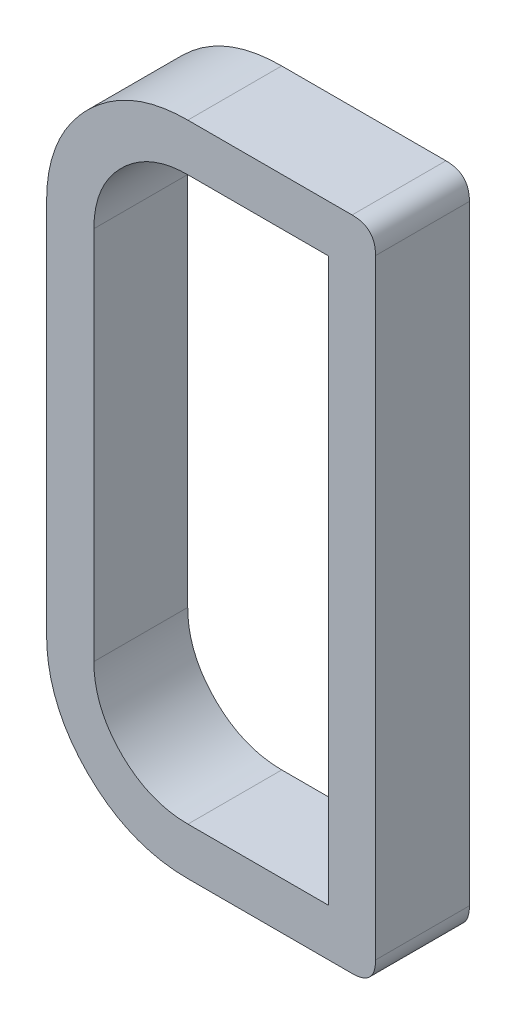
ISO-10303-21;
HEADER;
FILE_DESCRIPTION(('STEP AP214'),'2;1');
FILE_NAME('part.step','',(''),(''),'','','');
FILE_SCHEMA(('AUTOMOTIVE_DESIGN { 1 0 10303 214 1 1 1 1 }'));
ENDSEC;
DATA;
#1=APPLICATION_CONTEXT('core data for automotive mechanical design processes');
#2=APPLICATION_PROTOCOL_DEFINITION('international standard','automotive_design',2000,#1);
#3=PRODUCT_CONTEXT('',#1,'mechanical');
#4=PRODUCT('Part','Part','',(#3));
#5=PRODUCT_RELATED_PRODUCT_CATEGORY('part','',(#4));
#6=PRODUCT_DEFINITION_FORMATION('','',#4);
#7=PRODUCT_DEFINITION_CONTEXT('part definition',#1,'design');
#8=PRODUCT_DEFINITION('design','',#6,#7);
#9=PRODUCT_DEFINITION_SHAPE('','',#8);
#10=(LENGTH_UNIT() NAMED_UNIT(*) SI_UNIT(.MILLI.,.METRE.));
#11=(NAMED_UNIT(*) PLANE_ANGLE_UNIT() SI_UNIT($,.RADIAN.));
#12=(NAMED_UNIT(*) SI_UNIT($,.STERADIAN.) SOLID_ANGLE_UNIT());
#13=UNCERTAINTY_MEASURE_WITH_UNIT(LENGTH_MEASURE(1.E-05),#10,'distance_accuracy_value','');
#14=(GEOMETRIC_REPRESENTATION_CONTEXT(3) GLOBAL_UNCERTAINTY_ASSIGNED_CONTEXT((#13)) GLOBAL_UNIT_ASSIGNED_CONTEXT((#10,
#11,#12)) REPRESENTATION_CONTEXT('',''));
#15=CARTESIAN_POINT('',(0.,0.,0.));
#16=DIRECTION('',(0.,0.,1.));
#17=DIRECTION('',(1.,0.,0.));
#18=AXIS2_PLACEMENT_3D('',#15,#16,#17);
#19=CARTESIAN_POINT('',(0.,0.,-0.1));
#20=DIRECTION('',(0.,0.,1.));
#21=DIRECTION('',(1.,0.,0.));
#22=AXIS2_PLACEMENT_3D('',#19,#20,#21);
#23=PLANE('',#22);
#24=CARTESIAN_POINT('',(19.7006877553988,0.828607417590619,-0.1));
#25=CARTESIAN_POINT('',(19.7006635380005,0.837095711869263,-0.1));
#26=CARTESIAN_POINT('',(19.7012940386907,0.845611229965682,-0.1));
#27=CARTESIAN_POINT('',(19.7039507812606,0.862369509866044,-0.1));
#28=CARTESIAN_POINT('',(19.7059693096035,0.870613516517546,-0.1));
#29=CARTESIAN_POINT('',(19.7115454341526,0.886773178000316,-0.1));
#30=CARTESIAN_POINT('',(19.7151351855206,0.894677963289973,-0.1));
#31=CARTESIAN_POINT('',(19.7237152549404,0.909691898503987,-0.1));
#32=CARTESIAN_POINT('',(19.7287077107113,0.916799810681306,-0.1));
#33=CARTESIAN_POINT('',(19.7393640379182,0.9296171225671,-0.1));
#34=CARTESIAN_POINT('',(19.744952041715,0.935390799633083,-0.1));
#35=CARTESIAN_POINT('',(19.7568866108257,0.946088280643454,-0.1));
#36=CARTESIAN_POINT('',(19.7632325135923,0.951012817824839,-0.1));
#37=CARTESIAN_POINT('',(19.7775506479953,0.960324468779302,-0.1));
#38=CARTESIAN_POINT('',(19.7856269832257,0.964554807323652,-0.1));
#39=CARTESIAN_POINT('',(19.8024531318887,0.971355395513949,-0.1));
#40=CARTESIAN_POINT('',(19.8112030744294,0.973925326023775,-0.1));
#41=CARTESIAN_POINT('',(19.8252276822658,0.976678207307323,-0.1));
#42=CARTESIAN_POINT('',(19.830403416927,0.977411194982046,-0.1));
#43=CARTESIAN_POINT('',(19.8407885022976,0.978371760990806,-0.1));
#44=CARTESIAN_POINT('',(19.845997727714,0.978600672394268,-0.1));
#45=CARTESIAN_POINT('',(19.8512052553988,0.978599917590619,-0.1));
#46=B_SPLINE_CURVE_WITH_KNOTS('',3,(#24,#25,#26,#27,#28,#29,#30,#31,#32,#33,#34,#35,#36,#37,#38,
#39,#40,#41,#42,#43,#44,#45),.UNSPECIFIED.,.F.,.F.,(4,2,2,2,2,2,2,2,2,2,4),(0.,
0.0254799459725504,0.0508194273136038,0.0767036772743641,0.102627590775768,0.126654442565666,
0.150660441990456,0.177835627908208,0.205016035437336,0.220675958144204,0.236294416962494),.UNSPECIFIED.);
#47=CARTESIAN_POINT('',(19.7006877553988,0.828607417590619,-0.1));
#48=VERTEX_POINT('',#47);
#49=CARTESIAN_POINT('',(19.8512052553988,0.978599917590619,-0.1));
#50=VERTEX_POINT('',#49);
#51=EDGE_CURVE('E282',#48,#50,#46,.T.);
#52=ORIENTED_EDGE('',*,*,#51,.T.);
#53=DIRECTION('',(1.,0.,0.));
#54=VECTOR('',#53,1.);
#55=CARTESIAN_POINT('',(20.0262402553988,0.978599917590619,-0.1));
#56=LINE('',#55,#54);
#57=CARTESIAN_POINT('',(20.0262402553988,0.978599917590619,-0.1));
#58=VERTEX_POINT('',#57);
#59=EDGE_CURVE('E165',#58,#50,#56,.F.);
#60=ORIENTED_EDGE('',*,*,#59,.F.);
#61=CARTESIAN_POINT('',(20.0262402553988,0.978599917590619,-0.1));
#62=CARTESIAN_POINT('',(20.0282999608987,0.978591434691231,-0.1));
#63=CARTESIAN_POINT('',(20.030392004948,0.978470122288889,-0.1));
#64=CARTESIAN_POINT('',(20.0345568481788,0.977837537433673,-0.1));
#65=CARTESIAN_POINT('',(20.0366282663508,0.977317936220471,-0.1));
#66=CARTESIAN_POINT('',(20.0405570432505,0.975715407848176,-0.1));
#67=CARTESIAN_POINT('',(20.0424155405697,0.974635665981654,-0.1));
#68=CARTESIAN_POINT('',(20.045628721554,0.971867018021044,-0.1));
#69=CARTESIAN_POINT('',(20.0469814825394,0.97017583433668,-0.1));
#70=CARTESIAN_POINT('',(20.0493008763378,0.966060712736314,-0.1));
#71=CARTESIAN_POINT('',(20.0501120803445,0.963557523188162,-0.1));
#72=CARTESIAN_POINT('',(20.0510682777448,0.958534155758974,-0.1));
#73=CARTESIAN_POINT('',(20.0512420633129,0.956019998973866,-0.1));
#74=CARTESIAN_POINT('',(20.0512477553988,0.953592417590619,-0.1));
#75=B_SPLINE_CURVE_WITH_KNOTS('',3,(#61,#62,#63,#64,#65,#66,#67,#68,#69,#70,#71,#72,#73,#74),
.UNSPECIFIED.,.F.,.F.,(4,2,2,2,2,2,4),(0.,0.00622777758797022,0.0125894636584598,
0.0189153636395637,0.0252650742406141,0.0330438937542887,0.0404666885216107),.UNSPECIFIED.);
#76=CARTESIAN_POINT('',(20.0512477553988,0.953592417590619,-0.1));
#77=VERTEX_POINT('',#76);
#78=EDGE_CURVE('E177',#58,#77,#75,.T.);
#79=ORIENTED_EDGE('',*,*,#78,.T.);
#80=DIRECTION('',(0.,1.,0.));
#81=VECTOR('',#80,1.);
#82=CARTESIAN_POINT('',(20.0512477553988,0.303607417590619,-0.1));
#83=LINE('',#82,#81);
#84=CARTESIAN_POINT('',(20.0512477553988,0.303607417590619,-0.1));
#85=VERTEX_POINT('',#84);
#86=EDGE_CURVE('E174',#85,#77,#83,.T.);
#87=ORIENTED_EDGE('',*,*,#86,.F.);
#88=CARTESIAN_POINT('',(20.0512477553988,0.303607417590619,-0.1));
#89=CARTESIAN_POINT('',(20.0512392724994,0.301547712090766,-0.1));
#90=CARTESIAN_POINT('',(20.0511179600971,0.299455668041442,-0.1));
#91=CARTESIAN_POINT('',(20.0504853752419,0.295290824810583,-0.1));
#92=CARTESIAN_POINT('',(20.0499657740287,0.293219406638593,-0.1));
#93=CARTESIAN_POINT('',(20.0483632456564,0.289290629738958,-0.1));
#94=CARTESIAN_POINT('',(20.0472835037898,0.287432132419772,-0.1));
#95=CARTESIAN_POINT('',(20.0445148558292,0.284218951435451,-0.1));
#96=CARTESIAN_POINT('',(20.0428236721449,0.282866190450002,-0.1));
#97=CARTESIAN_POINT('',(20.0387085505445,0.280546796651611,-0.1));
#98=CARTESIAN_POINT('',(20.0362053609963,0.279735592644874,-0.1));
#99=CARTESIAN_POINT('',(20.0311819935672,0.278779395244613,-0.1));
#100=CARTESIAN_POINT('',(20.028667836782,0.278605609676531,-0.1));
#101=CARTESIAN_POINT('',(20.0262402553988,0.278599917590619,-0.1));
#102=B_SPLINE_CURVE_WITH_KNOTS('',3,(#88,#89,#90,#91,#92,#93,#94,#95,#96,#97,#98,#99,#100,#101),
.UNSPECIFIED.,.F.,.F.,(4,2,2,2,2,2,4),(0.,0.00622777758796518,0.0125894636584495,
0.0189153636395583,0.0252650742406127,0.0330438937542816,0.0404666885216132),.UNSPECIFIED.);
#103=CARTESIAN_POINT('',(20.0262402553988,0.278599917590619,-0.1));
#104=VERTEX_POINT('',#103);
#105=EDGE_CURVE('E181',#85,#104,#102,.T.);
#106=ORIENTED_EDGE('',*,*,#105,.T.);
#107=DIRECTION('',(1.,0.,0.));
#108=VECTOR('',#107,1.);
#109=CARTESIAN_POINT('',(19.8512052553988,0.278599917590619,-0.1));
#110=LINE('',#109,#108);
#111=CARTESIAN_POINT('',(19.8512052553988,0.278599917590619,-0.1));
#112=VERTEX_POINT('',#111);
#113=EDGE_CURVE('E179',#112,#104,#110,.T.);
#114=ORIENTED_EDGE('',*,*,#113,.F.);
#115=CARTESIAN_POINT('',(19.8512052553988,0.278599917590619,-0.1));
#116=CARTESIAN_POINT('',(19.8427190039802,0.278576328759325,-0.1));
#117=CARTESIAN_POINT('',(19.8342065999139,0.279202137932606,-0.1));
#118=CARTESIAN_POINT('',(19.8174502648927,0.28183723380529,-0.1));
#119=CARTESIAN_POINT('',(19.8092051213177,0.283838943898873,-0.1));
#120=CARTESIAN_POINT('',(19.7929635152497,0.289390989450044,-0.1));
#121=CARTESIAN_POINT('',(19.7849821088099,0.292986317415567,-0.1));
#122=CARTESIAN_POINT('',(19.7698160297023,0.301591604775748,-0.1));
#123=CARTESIAN_POINT('',(19.7626327183056,0.306603930998243,-0.1));
#124=CARTESIAN_POINT('',(19.749662822604,0.317313859062838,-0.1));
#125=CARTESIAN_POINT('',(19.7438129142625,0.322936145034271,-0.1));
#126=CARTESIAN_POINT('',(19.7329869952836,0.334963170155132,-0.1));
#127=CARTESIAN_POINT('',(19.7280100284894,0.34136704000494,-0.1));
#128=CARTESIAN_POINT('',(19.7186927344604,0.355726918227136,-0.1));
#129=CARTESIAN_POINT('',(19.7144942689536,0.363776840604642,-0.1));
#130=CARTESIAN_POINT('',(19.707759953304,0.380547794035207,-0.1));
#131=CARTESIAN_POINT('',(19.7052246216075,0.389269033411206,-0.1));
#132=CARTESIAN_POINT('',(19.7025406910096,0.403157771543193,-0.1));
#133=CARTESIAN_POINT('',(19.7018338838535,0.408226799365103,-0.1));
#134=CARTESIAN_POINT('',(19.7009078177091,0.418395261094048,-0.1));
#135=CARTESIAN_POINT('',(19.7006871671806,0.423494566216435,-0.1));
#136=CARTESIAN_POINT('',(19.7006877553988,0.428592417590619,-0.1));
#137=B_SPLINE_CURVE_WITH_KNOTS('',3,(#115,#116,#117,#118,#119,#120,#121,#122,#123,#124,#125,
#126,#127,#128,#129,#130,#131,#132,#133,#134,#135,#136),.UNSPECIFIED.,.F.,.F.,(4,2,2,2,2,2,2,2,
2,2,4),(0.,0.0254724896001254,0.0508058231505197,0.0769051046070071,0.103048240197168,
0.127309216310364,0.151543450464142,0.178602923070507,0.205670826883664,0.221004101678895,
0.236293430267935),.UNSPECIFIED.);
#138=CARTESIAN_POINT('',(19.7006877553988,0.428592417590619,-0.1));
#139=VERTEX_POINT('',#138);
#140=EDGE_CURVE('E172',#112,#139,#137,.T.);
#141=ORIENTED_EDGE('',*,*,#140,.T.);
#142=DIRECTION('',(0.,1.,0.));
#143=VECTOR('',#142,1.);
#144=CARTESIAN_POINT('',(19.7006877553988,0.828607417590619,-0.1));
#145=LINE('',#144,#143);
#146=EDGE_CURVE('E169',#48,#139,#145,.F.);
#147=ORIENTED_EDGE('',*,*,#146,.F.);
#148=EDGE_LOOP('',(#52,#60,#79,#87,#106,#114,#141,#147));
#149=FACE_BOUND('',#148,.T.);
#150=DIRECTION('',(1.,0.,0.));
#151=VECTOR('',#150,1.);
#152=CARTESIAN_POINT('',(20.0008477553987,0.328999917590619,-0.1));
#153=LINE('',#152,#151);
#154=CARTESIAN_POINT('',(19.8512927553988,0.328999917590619,-0.1));
#155=VERTEX_POINT('',#154);
#156=CARTESIAN_POINT('',(20.0008477553987,0.328999917590619,-0.1));
#157=VERTEX_POINT('',#156);
#158=EDGE_CURVE('E129',#155,#157,#153,.T.);
#159=ORIENTED_EDGE('',*,*,#158,.T.);
#160=DIRECTION('',(0.,1.,0.));
#161=VECTOR('',#160,1.);
#162=CARTESIAN_POINT('',(20.0008477553987,0.928199917590619,-0.1));
#163=LINE('',#162,#161);
#164=CARTESIAN_POINT('',(20.0008477553987,0.928199917590619,-0.1));
#165=VERTEX_POINT('',#164);
#166=EDGE_CURVE('E123',#157,#165,#163,.T.);
#167=ORIENTED_EDGE('',*,*,#166,.T.);
#168=DIRECTION('',(1.,0.,0.));
#169=VECTOR('',#168,1.);
#170=CARTESIAN_POINT('',(19.8512927553988,0.928199917590619,-0.1));
#171=LINE('',#170,#169);
#172=CARTESIAN_POINT('',(19.8512927553988,0.928199917590619,-0.1));
#173=VERTEX_POINT('',#172);
#174=EDGE_CURVE('E126',#165,#173,#171,.F.);
#175=ORIENTED_EDGE('',*,*,#174,.T.);
#176=CARTESIAN_POINT('',(19.7510877553988,0.828327417590619,-0.1));
#177=CARTESIAN_POINT('',(19.7510724823026,0.833864784296192,-0.1));
#178=CARTESIAN_POINT('',(19.751479653661,0.839418898084111,-0.1));
#179=CARTESIAN_POINT('',(19.7531913850151,0.850354494560382,-0.1));
#180=CARTESIAN_POINT('',(19.754491181003,0.855736735725573,-0.1));
#181=CARTESIAN_POINT('',(19.7580501828116,0.866216830108403,-0.1));
#182=CARTESIAN_POINT('',(19.7603152138118,0.871312740438752,-0.1));
#183=CARTESIAN_POINT('',(19.7657192309605,0.881021195973945,-0.1));
#184=CARTESIAN_POINT('',(19.7688593985893,0.88563307604369,-0.1));
#185=CARTESIAN_POINT('',(19.7756770066035,0.894108473427077,-0.1));
#186=CARTESIAN_POINT('',(19.7793256114993,0.897995610940268,-0.1));
#187=CARTESIAN_POINT('',(19.7871212097889,0.905232272985821,-0.1));
#188=CARTESIAN_POINT('',(19.7912680172491,0.908581997002279,-0.1));
#189=CARTESIAN_POINT('',(19.8007233645099,0.915023822365119,-0.1));
#190=CARTESIAN_POINT('',(19.8061127331968,0.918000077451383,-0.1));
#191=CARTESIAN_POINT('',(19.8173751204021,0.9228238507174,-0.1));
#192=CARTESIAN_POINT('',(19.8232480033487,0.924671684078829,-0.1));
#193=CARTESIAN_POINT('',(19.8328595619275,0.926721652020573,-0.1));
#194=CARTESIAN_POINT('',(19.836526790657,0.927285390303791,-0.1));
#195=CARTESIAN_POINT('',(19.8438942624351,0.928024711158493,-0.1));
#196=CARTESIAN_POINT('',(19.8475944359218,0.928200975953126,-0.1));
#197=CARTESIAN_POINT('',(19.8512927553988,0.928199917590619,-0.1));
#198=B_SPLINE_CURVE_WITH_KNOTS('',3,(#176,#177,#178,#179,#180,#181,#182,#183,#184,#185,#186,
#187,#188,#189,#190,#191,#192,#193,#194,#195,#196,#197),.UNSPECIFIED.,.F.,.F.,(4,2,2,2,2,2,2,2,
2,2,4),(0.,0.016620869505609,0.0331537145670684,0.0497877804969031,0.0664444129915322,
0.0823863253850861,0.098322306493281,0.116671746140973,0.135016058223824,0.146127993345516,
0.157220348000502),.UNSPECIFIED.);
#199=CARTESIAN_POINT('',(19.7510877553988,0.828327417590619,-0.1));
#200=VERTEX_POINT('',#199);
#201=EDGE_CURVE('E143',#200,#173,#198,.T.);
#202=ORIENTED_EDGE('',*,*,#201,.F.);
#203=DIRECTION('',(0.,1.,0.));
#204=VECTOR('',#203,1.);
#205=CARTESIAN_POINT('',(19.7510877553988,0.428872417590619,-0.1));
#206=LINE('',#205,#204);
#207=CARTESIAN_POINT('',(19.7510877553988,0.428872417590619,-0.1));
#208=VERTEX_POINT('',#207);
#209=EDGE_CURVE('E164',#200,#208,#206,.F.);
#210=ORIENTED_EDGE('',*,*,#209,.T.);
#211=CARTESIAN_POINT('',(19.8512927553988,0.328999917590619,-0.1));
#212=CARTESIAN_POINT('',(19.8457092869254,0.328984175421207,-0.1));
#213=CARTESIAN_POINT('',(19.8401094967002,0.329396921773739,-0.1));
#214=CARTESIAN_POINT('',(19.8290870014734,0.331128763447091,-0.1));
#215=CARTESIAN_POINT('',(19.8236634683031,0.332442673373434,-0.1));
#216=CARTESIAN_POINT('',(19.8131041264262,0.336035486608142,-0.1));
#217=CARTESIAN_POINT('',(19.8079702217479,0.338320085275741,-0.1));
#218=CARTESIAN_POINT('',(19.7981867711691,0.343767351618156,-0.1));
#219=CARTESIAN_POINT('',(19.7935380435837,0.3469314708221,-0.1));
#220=CARTESIAN_POINT('',(19.7849681279728,0.35380947369186,-0.1));
#221=CARTESIAN_POINT('',(19.7810258041194,0.357497466755734,-0.1));
#222=CARTESIAN_POINT('',(19.773700077093,0.36539038529124,-0.1));
#223=CARTESIAN_POINT('',(19.770316254268,0.3695949184579,-0.1));
#224=CARTESIAN_POINT('',(19.76389428156,0.379107978015537,-0.1));
#225=CARTESIAN_POINT('',(19.7609610575554,0.384488969781783,-0.1));
#226=CARTESIAN_POINT('',(19.7562272283049,0.395729336234024,-0.1));
#227=CARTESIAN_POINT('',(19.7544265968842,0.401588699861085,-0.1));
#228=CARTESIAN_POINT('',(19.7524707306617,0.411064133003247,-0.1));
#229=CARTESIAN_POINT('',(19.7519432146975,0.41460946123252,-0.1));
#230=CARTESIAN_POINT('',(19.7512517627549,0.421727882702627,-0.1));
#231=CARTESIAN_POINT('',(19.7510870082001,0.42530089513733,-0.1));
#232=CARTESIAN_POINT('',(19.7510877553988,0.428872417590619,-0.1));
#233=B_SPLINE_CURVE_WITH_KNOTS('',3,(#211,#212,#213,#214,#215,#216,#217,#218,#219,#220,#221,
#222,#223,#224,#225,#226,#227,#228,#229,#230,#231,#232),.UNSPECIFIED.,.F.,.F.,(4,2,2,2,2,2,2,2,
2,2,4),(0.,0.01675811935593,0.0334206108332371,0.0501822470186732,0.0669717119492594,
0.083114049271645,0.0992442016392981,0.117507922331229,0.135771220924495,0.146507309578728,
0.157219147156361),.UNSPECIFIED.);
#234=EDGE_CURVE('E24',#155,#208,#233,.T.);
#235=ORIENTED_EDGE('',*,*,#234,.F.);
#236=EDGE_LOOP('',(#159,#167,#175,#202,#210,#235));
#237=FACE_BOUND('',#236,.T.);
#238=ADVANCED_FACE('F17',(#149,#237),#23,.F.);
#239=CARTESIAN_POINT('',(19.7510877553988,0.428872417590619,-0.1));
#240=CARTESIAN_POINT('',(19.7510877553988,0.387414917590619,-0.1));
#241=CARTESIAN_POINT('',(19.8099052553988,0.328999917590619,-0.1));
#242=CARTESIAN_POINT('',(19.8512927553988,0.328999917590619,-0.1));
#243=CARTESIAN_POINT('',(19.7510877553988,0.428872417590619,0.));
#244=CARTESIAN_POINT('',(19.7510877553988,0.387414917590619,0.));
#245=CARTESIAN_POINT('',(19.8099052553988,0.328999917590619,0.));
#246=CARTESIAN_POINT('',(19.8512927553988,0.328999917590619,0.));
#247=B_SPLINE_SURFACE_WITH_KNOTS('',1,2,((#239,#240,#241,#242),(#243,#244,#245,#246)),
.UNSPECIFIED.,.F.,.F.,.F.,(2,2),(3,1,3),(0.,1.),(0.,0.5,1.),.UNSPECIFIED.);
#248=DIRECTION('',(0.,0.,1.));
#249=VECTOR('',#248,1.);
#250=CARTESIAN_POINT('',(19.7510877553988,0.428872417590619,-0.1));
#251=LINE('',#250,#249);
#252=CARTESIAN_POINT('',(19.7510877553988,0.428872417590619,0.));
#253=VERTEX_POINT('',#252);
#254=EDGE_CURVE('E162',#208,#253,#251,.T.);
#255=CARTESIAN_POINT('',(19.8512927553988,0.328999917590619,0.));
#256=CARTESIAN_POINT('',(19.8457092869254,0.328984175421208,0.));
#257=CARTESIAN_POINT('',(19.8401094967002,0.32939692177374,0.));
#258=CARTESIAN_POINT('',(19.8290870014734,0.331128763447091,0.));
#259=CARTESIAN_POINT('',(19.8236634683031,0.332442673373434,0.));
#260=CARTESIAN_POINT('',(19.8131041264262,0.336035486608142,0.));
#261=CARTESIAN_POINT('',(19.8079702217479,0.338320085275743,0.));
#262=CARTESIAN_POINT('',(19.7981867711691,0.343767351618158,0.));
#263=CARTESIAN_POINT('',(19.7935380435837,0.3469314708221,0.));
#264=CARTESIAN_POINT('',(19.7849681279728,0.35380947369186,0.));
#265=CARTESIAN_POINT('',(19.7810258041194,0.357497466755733,0.));
#266=CARTESIAN_POINT('',(19.773700077093,0.365390385291239,0.));
#267=CARTESIAN_POINT('',(19.770316254268,0.3695949184579,0.));
#268=CARTESIAN_POINT('',(19.76389428156,0.379107978015538,0.));
#269=CARTESIAN_POINT('',(19.7609610575554,0.384488969781783,0.));
#270=CARTESIAN_POINT('',(19.7562272283049,0.395729336234024,0.));
#271=CARTESIAN_POINT('',(19.7544265968842,0.401588699861085,0.));
#272=CARTESIAN_POINT('',(19.7524707306617,0.411064133003247,0.));
#273=CARTESIAN_POINT('',(19.7519432146975,0.41460946123252,0.));
#274=CARTESIAN_POINT('',(19.7512517627549,0.421727882702627,0.));
#275=CARTESIAN_POINT('',(19.7510870082001,0.42530089513733,0.));
#276=CARTESIAN_POINT('',(19.7510877553988,0.428872417590619,0.));
#277=B_SPLINE_CURVE_WITH_KNOTS('',3,(#255,#256,#257,#258,#259,#260,#261,#262,#263,#264,#265,
#266,#267,#268,#269,#270,#271,#272,#273,#274,#275,#276),.UNSPECIFIED.,.F.,.F.,(4,2,2,2,2,2,2,2,
2,2,4),(0.,0.01675811935593,0.033420610833237,0.0501822470186737,0.0669717119492591,
0.0831140492716439,0.0992442016392979,0.117507922331228,0.135771220924495,0.146507309578728,
0.157219147156361),.UNSPECIFIED.);
#278=CARTESIAN_POINT('',(19.8512927553988,0.328999917590619,0.));
#279=VERTEX_POINT('',#278);
#280=EDGE_CURVE('E347',#279,#253,#277,.T.);
#281=DIRECTION('',(0.,0.,-1.));
#282=VECTOR('',#281,1.);
#283=CARTESIAN_POINT('',(19.8512927553988,0.328999917590619,-0.1));
#284=LINE('',#283,#282);
#285=EDGE_CURVE('E149',#279,#155,#284,.T.);
#286=ORIENTED_EDGE('',*,*,#234,.T.);
#287=ORIENTED_EDGE('',*,*,#254,.T.);
#288=ORIENTED_EDGE('',*,*,#280,.F.);
#289=ORIENTED_EDGE('',*,*,#285,.T.);
#290=EDGE_LOOP('',(#286,#287,#288,#289));
#291=FACE_BOUND('',#290,.T.);
#292=ADVANCED_FACE('F272',(#291),#247,.T.);
#293=CARTESIAN_POINT('',(19.7510877553988,0.428872417590619,-0.1));
#294=DIRECTION('',(-1.,0.,0.));
#295=DIRECTION('',(0.,0.,1.));
#296=AXIS2_PLACEMENT_3D('',#293,#294,#295);
#297=PLANE('',#296);
#298=ORIENTED_EDGE('',*,*,#254,.F.);
#299=ORIENTED_EDGE('',*,*,#209,.F.);
#300=DIRECTION('',(0.,0.,-1.));
#301=VECTOR('',#300,1.);
#302=CARTESIAN_POINT('',(19.7510877553988,0.828327417590619,-0.05));
#303=LINE('',#302,#301);
#304=CARTESIAN_POINT('',(19.7510877553988,0.828327417590619,0.));
#305=VERTEX_POINT('',#304);
#306=EDGE_CURVE('E159',#305,#200,#303,.T.);
#307=ORIENTED_EDGE('',*,*,#306,.F.);
#308=DIRECTION('',(0.,1.,0.));
#309=VECTOR('',#308,1.);
#310=CARTESIAN_POINT('',(19.7510877553988,0.,0.));
#311=LINE('',#310,#309);
#312=EDGE_CURVE('E339',#253,#305,#311,.T.);
#313=ORIENTED_EDGE('',*,*,#312,.F.);
#314=EDGE_LOOP('',(#298,#299,#307,#313));
#315=FACE_BOUND('',#314,.T.);
#316=ADVANCED_FACE('F274',(#315),#297,.F.);
#317=CARTESIAN_POINT('',(19.8512927553988,0.928199917590619,-0.1));
#318=CARTESIAN_POINT('',(19.8099052553988,0.928199917590619,-0.1));
#319=CARTESIAN_POINT('',(19.7510877553988,0.869784917590619,-0.1));
#320=CARTESIAN_POINT('',(19.7510877553988,0.828327417590619,-0.1));
#321=CARTESIAN_POINT('',(19.8512927553988,0.928199917590619,0.));
#322=CARTESIAN_POINT('',(19.8099052553988,0.928199917590619,0.));
#323=CARTESIAN_POINT('',(19.7510877553988,0.869784917590619,0.));
#324=CARTESIAN_POINT('',(19.7510877553988,0.828327417590619,0.));
#325=B_SPLINE_SURFACE_WITH_KNOTS('',1,2,((#317,#318,#319,#320),(#321,#322,#323,#324)),
.UNSPECIFIED.,.F.,.F.,.F.,(2,2),(3,1,3),(0.,1.),(0.,0.5,1.),.UNSPECIFIED.);
#326=DIRECTION('',(0.,0.,1.));
#327=VECTOR('',#326,1.);
#328=CARTESIAN_POINT('',(19.8512927553988,0.928199917590619,-0.1));
#329=LINE('',#328,#327);
#330=CARTESIAN_POINT('',(19.8512927553988,0.928199917590619,0.));
#331=VERTEX_POINT('',#330);
#332=EDGE_CURVE('E135',#173,#331,#329,.T.);
#333=CARTESIAN_POINT('',(19.7510877553988,0.828327417590619,0.));
#334=CARTESIAN_POINT('',(19.7510724823026,0.833864784296192,0.));
#335=CARTESIAN_POINT('',(19.751479653661,0.839418898084111,0.));
#336=CARTESIAN_POINT('',(19.7531913850151,0.850354494560382,0.));
#337=CARTESIAN_POINT('',(19.754491181003,0.855736735725573,0.));
#338=CARTESIAN_POINT('',(19.7580501828116,0.866216830108403,0.));
#339=CARTESIAN_POINT('',(19.7603152138118,0.871312740438752,0.));
#340=CARTESIAN_POINT('',(19.7657192309605,0.881021195973945,0.));
#341=CARTESIAN_POINT('',(19.7688593985893,0.88563307604369,0.));
#342=CARTESIAN_POINT('',(19.7756770066035,0.894108473427077,0.));
#343=CARTESIAN_POINT('',(19.7793256114993,0.897995610940268,0.));
#344=CARTESIAN_POINT('',(19.7871212097889,0.905232272985821,0.));
#345=CARTESIAN_POINT('',(19.7912680172491,0.908581997002278,0.));
#346=CARTESIAN_POINT('',(19.8007233645099,0.915023822365119,0.));
#347=CARTESIAN_POINT('',(19.8061127331968,0.918000077451384,0.));
#348=CARTESIAN_POINT('',(19.8173751204021,0.922823850717401,0.));
#349=CARTESIAN_POINT('',(19.8232480033487,0.924671684078829,0.));
#350=CARTESIAN_POINT('',(19.8328595619275,0.926721652020573,0.));
#351=CARTESIAN_POINT('',(19.836526790657,0.927285390303791,0.));
#352=CARTESIAN_POINT('',(19.8438942624351,0.928024711158494,0.));
#353=CARTESIAN_POINT('',(19.8475944359218,0.928200975953126,0.));
#354=CARTESIAN_POINT('',(19.8512927553988,0.928199917590619,0.));
#355=B_SPLINE_CURVE_WITH_KNOTS('',3,(#333,#334,#335,#336,#337,#338,#339,#340,#341,#342,#343,
#344,#345,#346,#347,#348,#349,#350,#351,#352,#353,#354),.UNSPECIFIED.,.F.,.F.,(4,2,2,2,2,2,2,2,
2,2,4),(0.,0.016620869505609,0.0331537145670684,0.0497877804969031,0.0664444129915322,
0.0823863253850861,0.098322306493281,0.116671746140974,0.135016058223824,0.146127993345516,
0.157220348000502),.UNSPECIFIED.);
#356=EDGE_CURVE('E211',#305,#331,#355,.T.);
#357=ORIENTED_EDGE('',*,*,#201,.T.);
#358=ORIENTED_EDGE('',*,*,#332,.T.);
#359=ORIENTED_EDGE('',*,*,#356,.F.);
#360=ORIENTED_EDGE('',*,*,#306,.T.);
#361=EDGE_LOOP('',(#357,#358,#359,#360));
#362=FACE_BOUND('',#361,.T.);
#363=ADVANCED_FACE('F242',(#362),#325,.T.);
#364=CARTESIAN_POINT('',(19.8512927553988,0.928199917590619,-0.1));
#365=DIRECTION('',(0.,1.,0.));
#366=DIRECTION('',(0.,0.,1.));
#367=AXIS2_PLACEMENT_3D('',#364,#365,#366);
#368=PLANE('',#367);
#369=ORIENTED_EDGE('',*,*,#332,.F.);
#370=ORIENTED_EDGE('',*,*,#174,.F.);
#371=DIRECTION('',(0.,0.,-1.));
#372=VECTOR('',#371,1.);
#373=CARTESIAN_POINT('',(20.0008477553987,0.928199917590619,-0.1));
#374=LINE('',#373,#372);
#375=CARTESIAN_POINT('',(20.0008477553987,0.928199917590619,0.));
#376=VERTEX_POINT('',#375);
#377=EDGE_CURVE('E134',#165,#376,#374,.F.);
#378=ORIENTED_EDGE('',*,*,#377,.T.);
#379=DIRECTION('',(1.,0.,0.));
#380=VECTOR('',#379,1.);
#381=CARTESIAN_POINT('',(0.,0.928199917590619,0.));
#382=LINE('',#381,#380);
#383=EDGE_CURVE('E333',#331,#376,#382,.T.);
#384=ORIENTED_EDGE('',*,*,#383,.F.);
#385=EDGE_LOOP('',(#369,#370,#378,#384));
#386=FACE_BOUND('',#385,.T.);
#387=ADVANCED_FACE('F140',(#386),#368,.F.);
#388=CARTESIAN_POINT('',(20.0008477553987,0.928199917590619,-0.1));
#389=DIRECTION('',(1.,0.,0.));
#390=DIRECTION('',(0.,0.,-1.));
#391=AXIS2_PLACEMENT_3D('',#388,#389,#390);
#392=PLANE('',#391);
#393=ORIENTED_EDGE('',*,*,#377,.F.);
#394=ORIENTED_EDGE('',*,*,#166,.F.);
#395=DIRECTION('',(0.,0.,-1.));
#396=VECTOR('',#395,1.);
#397=CARTESIAN_POINT('',(20.0008477553987,0.328999917590619,-0.1));
#398=LINE('',#397,#396);
#399=CARTESIAN_POINT('',(20.0008477553987,0.328999917590619,0.));
#400=VERTEX_POINT('',#399);
#401=EDGE_CURVE('E173',#157,#400,#398,.F.);
#402=ORIENTED_EDGE('',*,*,#401,.T.);
#403=DIRECTION('',(0.,1.,0.));
#404=VECTOR('',#403,1.);
#405=CARTESIAN_POINT('',(20.0008477553987,0.,0.));
#406=LINE('',#405,#404);
#407=EDGE_CURVE('E147',#376,#400,#406,.F.);
#408=ORIENTED_EDGE('',*,*,#407,.F.);
#409=EDGE_LOOP('',(#393,#394,#402,#408));
#410=FACE_BOUND('',#409,.T.);
#411=ADVANCED_FACE('F145',(#410),#392,.F.);
#412=CARTESIAN_POINT('',(20.0008477553987,0.328999917590619,-0.1));
#413=DIRECTION('',(0.,-1.,0.));
#414=DIRECTION('',(0.,0.,-1.));
#415=AXIS2_PLACEMENT_3D('',#412,#413,#414);
#416=PLANE('',#415);
#417=ORIENTED_EDGE('',*,*,#401,.F.);
#418=ORIENTED_EDGE('',*,*,#158,.F.);
#419=ORIENTED_EDGE('',*,*,#285,.F.);
#420=DIRECTION('',(1.,0.,0.));
#421=VECTOR('',#420,1.);
#422=CARTESIAN_POINT('',(0.,0.328999917590619,0.));
#423=LINE('',#422,#421);
#424=EDGE_CURVE('E332',#400,#279,#423,.F.);
#425=ORIENTED_EDGE('',*,*,#424,.F.);
#426=EDGE_LOOP('',(#417,#418,#419,#425));
#427=FACE_BOUND('',#426,.T.);
#428=ADVANCED_FACE('F381',(#427),#416,.F.);
#429=CARTESIAN_POINT('',(19.7006877553988,0.828607417590619,-0.1));
#430=DIRECTION('',(-1.,0.,0.));
#431=DIRECTION('',(0.,0.,1.));
#432=AXIS2_PLACEMENT_3D('',#429,#430,#431);
#433=PLANE('',#432);
#434=ORIENTED_EDGE('',*,*,#146,.T.);
#435=DIRECTION('',(0.,0.,1.));
#436=VECTOR('',#435,1.);
#437=CARTESIAN_POINT('',(19.7006877553988,0.428592417590619,-0.05));
#438=LINE('',#437,#436);
#439=CARTESIAN_POINT('',(19.7006877553988,0.428592417590619,0.));
#440=VERTEX_POINT('',#439);
#441=EDGE_CURVE('E261',#139,#440,#438,.T.);
#442=ORIENTED_EDGE('',*,*,#441,.T.);
#443=DIRECTION('',(0.,1.,0.));
#444=VECTOR('',#443,1.);
#445=CARTESIAN_POINT('',(19.7006877553988,0.,0.));
#446=LINE('',#445,#444);
#447=CARTESIAN_POINT('',(19.7006877553988,0.828607417590619,0.));
#448=VERTEX_POINT('',#447);
#449=EDGE_CURVE('E233',#448,#440,#446,.F.);
#450=ORIENTED_EDGE('',*,*,#449,.F.);
#451=DIRECTION('',(0.,0.,-1.));
#452=VECTOR('',#451,1.);
#453=CARTESIAN_POINT('',(19.7006877553988,0.828607417590619,-0.05));
#454=LINE('',#453,#452);
#455=EDGE_CURVE('E167',#448,#48,#454,.T.);
#456=ORIENTED_EDGE('',*,*,#455,.T.);
#457=EDGE_LOOP('',(#434,#442,#450,#456));
#458=FACE_BOUND('',#457,.T.);
#459=ADVANCED_FACE('F240',(#458),#433,.T.);
#460=CARTESIAN_POINT('',(19.7006877553988,0.428592417590619,-0.1));
#461=CARTESIAN_POINT('',(19.7006877553988,0.366099917590619,-0.1));
#462=CARTESIAN_POINT('',(19.7886952553987,0.278599917590619,-0.1));
#463=CARTESIAN_POINT('',(19.8512052553988,0.278599917590619,-0.1));
#464=CARTESIAN_POINT('',(19.7006877553988,0.428592417590619,0.));
#465=CARTESIAN_POINT('',(19.7006877553988,0.366099917590619,0.));
#466=CARTESIAN_POINT('',(19.7886952553987,0.278599917590619,0.));
#467=CARTESIAN_POINT('',(19.8512052553988,0.278599917590619,0.));
#468=B_SPLINE_SURFACE_WITH_KNOTS('',1,2,((#460,#461,#462,#463),(#464,#465,#466,#467)),
.UNSPECIFIED.,.F.,.F.,.F.,(2,2),(3,1,3),(0.,1.),(0.,0.5,1.),.UNSPECIFIED.);
#469=DIRECTION('',(0.,0.,-1.));
#470=VECTOR('',#469,1.);
#471=CARTESIAN_POINT('',(19.8512052553988,0.278599917590619,-0.1));
#472=LINE('',#471,#470);
#473=CARTESIAN_POINT('',(19.8512052553988,0.278599917590619,0.));
#474=VERTEX_POINT('',#473);
#475=EDGE_CURVE('E182',#474,#112,#472,.T.);
#476=CARTESIAN_POINT('',(19.7006877553988,0.428592417590619,0.));
#477=CARTESIAN_POINT('',(19.7006635380005,0.420104123311976,0.));
#478=CARTESIAN_POINT('',(19.7012940386907,0.411588605215556,0.));
#479=CARTESIAN_POINT('',(19.7039507812606,0.394830325315195,0.));
#480=CARTESIAN_POINT('',(19.7059693096035,0.386586318663692,0.));
#481=CARTESIAN_POINT('',(19.7115454341526,0.370426657180925,0.));
#482=CARTESIAN_POINT('',(19.7151351855206,0.362521871891271,0.));
#483=CARTESIAN_POINT('',(19.7237152549404,0.347507936677261,0.));
#484=CARTESIAN_POINT('',(19.7287077107112,0.340400024499944,0.));
#485=CARTESIAN_POINT('',(19.7393640379182,0.327582712614149,0.));
#486=CARTESIAN_POINT('',(19.7449520417149,0.321809035548162,0.));
#487=CARTESIAN_POINT('',(19.7568866108257,0.311111554537786,0.));
#488=CARTESIAN_POINT('',(19.7632325135923,0.306187017356399,0.));
#489=CARTESIAN_POINT('',(19.7775506479953,0.296875366401936,0.));
#490=CARTESIAN_POINT('',(19.7856269832257,0.292645027857586,0.));
#491=CARTESIAN_POINT('',(19.8024531318887,0.285844439667289,0.));
#492=CARTESIAN_POINT('',(19.8112030744294,0.283274509157463,0.));
#493=CARTESIAN_POINT('',(19.8252276822658,0.280521627873915,0.));
#494=CARTESIAN_POINT('',(19.830403416927,0.279788640199192,0.));
#495=CARTESIAN_POINT('',(19.8407885022976,0.278828074190432,0.));
#496=CARTESIAN_POINT('',(19.845997727714,0.27859916278697,0.));
#497=CARTESIAN_POINT('',(19.8512052553988,0.278599917590619,0.));
#498=B_SPLINE_CURVE_WITH_KNOTS('',3,(#476,#477,#478,#479,#480,#481,#482,#483,#484,#485,#486,
#487,#488,#489,#490,#491,#492,#493,#494,#495,#496,#497),.UNSPECIFIED.,.F.,.F.,(4,2,2,2,2,2,2,2,
2,2,4),(0.,0.0254799459725499,0.0508194273136029,0.0767036772743548,0.102627590775751,
0.126654442565656,0.150660441990462,0.177835627908214,0.205016035437338,0.220675958144202,
0.236294416962495),.UNSPECIFIED.);
#499=EDGE_CURVE('E226',#440,#474,#498,.T.);
#500=ORIENTED_EDGE('',*,*,#441,.F.);
#501=ORIENTED_EDGE('',*,*,#140,.F.);
#502=ORIENTED_EDGE('',*,*,#475,.F.);
#503=ORIENTED_EDGE('',*,*,#499,.F.);
#504=EDGE_LOOP('',(#500,#501,#502,#503));
#505=FACE_BOUND('',#504,.T.);
#506=ADVANCED_FACE('F234',(#505),#468,.F.);
#507=CARTESIAN_POINT('',(19.8512052553988,0.278599917590619,-0.1));
#508=DIRECTION('',(0.,-1.,0.));
#509=DIRECTION('',(0.,0.,-1.));
#510=AXIS2_PLACEMENT_3D('',#507,#508,#509);
#511=PLANE('',#510);
#512=ORIENTED_EDGE('',*,*,#113,.T.);
#513=DIRECTION('',(0.,0.,1.));
#514=VECTOR('',#513,1.);
#515=CARTESIAN_POINT('',(20.0262402553988,0.278599917590619,-0.05));
#516=LINE('',#515,#514);
#517=CARTESIAN_POINT('',(20.0262402553988,0.278599917590619,0.));
#518=VERTEX_POINT('',#517);
#519=EDGE_CURVE('E325',#104,#518,#516,.T.);
#520=ORIENTED_EDGE('',*,*,#519,.T.);
#521=DIRECTION('',(1.,0.,0.));
#522=VECTOR('',#521,1.);
#523=CARTESIAN_POINT('',(0.,0.278599917590619,0.));
#524=LINE('',#523,#522);
#525=EDGE_CURVE('E232',#474,#518,#524,.T.);
#526=ORIENTED_EDGE('',*,*,#525,.F.);
#527=ORIENTED_EDGE('',*,*,#475,.T.);
#528=EDGE_LOOP('',(#512,#520,#526,#527));
#529=FACE_BOUND('',#528,.T.);
#530=ADVANCED_FACE('F239',(#529),#511,.T.);
#531=CARTESIAN_POINT('',(20.0262402553988,0.278599917590619,-0.1));
#532=CARTESIAN_POINT('',(20.0512477553988,0.278599917590619,-0.1));
#533=CARTESIAN_POINT('',(20.0512477553988,0.303607417590619,-0.1));
#534=CARTESIAN_POINT('',(20.0262402553988,0.278599917590619,0.));
#535=CARTESIAN_POINT('',(20.0512477553988,0.278599917590619,0.));
#536=CARTESIAN_POINT('',(20.0512477553988,0.303607417590619,0.));
#537=B_SPLINE_SURFACE_WITH_KNOTS('',1,2,((#531,#532,#533),(#534,#535,#536)),.UNSPECIFIED.,.F.,
.F.,.F.,(2,2),(3,3),(0.,1.),(0.,1.),.UNSPECIFIED.);
#538=DIRECTION('',(0.,0.,-1.));
#539=VECTOR('',#538,1.);
#540=CARTESIAN_POINT('',(20.0512477553988,0.303607417590619,-0.1));
#541=LINE('',#540,#539);
#542=CARTESIAN_POINT('',(20.0512477553988,0.303607417590619,0.));
#543=VERTEX_POINT('',#542);
#544=EDGE_CURVE('E178',#543,#85,#541,.T.);
#545=CARTESIAN_POINT('',(20.0262402553988,0.278599917590619,0.));
#546=CARTESIAN_POINT('',(20.0282999608987,0.278608400490006,0.));
#547=CARTESIAN_POINT('',(20.030392004948,0.278729712892347,0.));
#548=CARTESIAN_POINT('',(20.0345568481788,0.279362297747563,0.));
#549=CARTESIAN_POINT('',(20.0366282663508,0.279881898960764,0.));
#550=CARTESIAN_POINT('',(20.0405570432504,0.281484427333053,0.));
#551=CARTESIAN_POINT('',(20.0424155405696,0.282564169199572,0.));
#552=CARTESIAN_POINT('',(20.045628721554,0.285332817160179,0.));
#553=CARTESIAN_POINT('',(20.0469814825394,0.287024000844544,0.));
#554=CARTESIAN_POINT('',(20.0493008763378,0.291139122444906,0.));
#555=CARTESIAN_POINT('',(20.0501120803445,0.293642311993052,0.));
#556=CARTESIAN_POINT('',(20.0510682777448,0.298665679422244,0.));
#557=CARTESIAN_POINT('',(20.0512420633129,0.301179836207362,0.));
#558=CARTESIAN_POINT('',(20.0512477553988,0.303607417590619,0.));
#559=B_SPLINE_CURVE_WITH_KNOTS('',3,(#545,#546,#547,#548,#549,#550,#551,#552,#553,#554,#555,
#556,#557,#558),.UNSPECIFIED.,.F.,.F.,(4,2,2,2,2,2,4),(0.,0.00622777758795972,
0.0125894636584345,0.0189153636395407,0.0252650742405982,0.0330438937542605,0.0404666885216114),.UNSPECIFIED.);
#560=EDGE_CURVE('E221',#518,#543,#559,.T.);
#561=ORIENTED_EDGE('',*,*,#519,.F.);
#562=ORIENTED_EDGE('',*,*,#105,.F.);
#563=ORIENTED_EDGE('',*,*,#544,.F.);
#564=ORIENTED_EDGE('',*,*,#560,.F.);
#565=EDGE_LOOP('',(#561,#562,#563,#564));
#566=FACE_BOUND('',#565,.T.);
#567=ADVANCED_FACE('F246',(#566),#537,.F.);
#568=CARTESIAN_POINT('',(20.0512477553988,0.303607417590619,-0.1));
#569=DIRECTION('',(1.,0.,0.));
#570=DIRECTION('',(0.,0.,-1.));
#571=AXIS2_PLACEMENT_3D('',#568,#569,#570);
#572=PLANE('',#571);
#573=ORIENTED_EDGE('',*,*,#86,.T.);
#574=DIRECTION('',(0.,0.,1.));
#575=VECTOR('',#574,1.);
#576=CARTESIAN_POINT('',(20.0512477553988,0.953592417590619,-0.05));
#577=LINE('',#576,#575);
#578=CARTESIAN_POINT('',(20.0512477553988,0.953592417590619,0.));
#579=VERTEX_POINT('',#578);
#580=EDGE_CURVE('E292',#77,#579,#577,.T.);
#581=ORIENTED_EDGE('',*,*,#580,.T.);
#582=DIRECTION('',(0.,1.,0.));
#583=VECTOR('',#582,1.);
#584=CARTESIAN_POINT('',(20.0512477553988,0.,0.));
#585=LINE('',#584,#583);
#586=EDGE_CURVE('E356',#543,#579,#585,.T.);
#587=ORIENTED_EDGE('',*,*,#586,.F.);
#588=ORIENTED_EDGE('',*,*,#544,.T.);
#589=EDGE_LOOP('',(#573,#581,#587,#588));
#590=FACE_BOUND('',#589,.T.);
#591=ADVANCED_FACE('F298',(#590),#572,.T.);
#592=CARTESIAN_POINT('',(20.0512477553988,0.953592417590619,-0.1));
#593=CARTESIAN_POINT('',(20.0512477553988,0.978599917590619,-0.1));
#594=CARTESIAN_POINT('',(20.0262402553988,0.978599917590619,-0.1));
#595=CARTESIAN_POINT('',(20.0512477553988,0.953592417590619,0.));
#596=CARTESIAN_POINT('',(20.0512477553988,0.978599917590619,0.));
#597=CARTESIAN_POINT('',(20.0262402553988,0.978599917590619,0.));
#598=B_SPLINE_SURFACE_WITH_KNOTS('',1,2,((#592,#593,#594),(#595,#596,#597)),.UNSPECIFIED.,.F.,
.F.,.F.,(2,2),(3,3),(0.,1.),(0.,1.),.UNSPECIFIED.);
#599=DIRECTION('',(0.,0.,1.));
#600=VECTOR('',#599,1.);
#601=CARTESIAN_POINT('',(20.0262402553988,0.978599917590619,-0.1));
#602=LINE('',#601,#600);
#603=CARTESIAN_POINT('',(20.0262402553988,0.978599917590619,0.));
#604=VERTEX_POINT('',#603);
#605=EDGE_CURVE('E168',#604,#58,#602,.F.);
#606=CARTESIAN_POINT('',(20.0512477553988,0.953592417590619,0.));
#607=CARTESIAN_POINT('',(20.0512392724994,0.95565212309047,0.));
#608=CARTESIAN_POINT('',(20.0511179600971,0.957744167139793,0.));
#609=CARTESIAN_POINT('',(20.0504853752419,0.96190901037065,0.));
#610=CARTESIAN_POINT('',(20.0499657740287,0.96398042854264,0.));
#611=CARTESIAN_POINT('',(20.0483632456564,0.967909205442274,0.));
#612=CARTESIAN_POINT('',(20.0472835037898,0.96976770276146,0.));
#613=CARTESIAN_POINT('',(20.0445148558292,0.972980883745781,0.));
#614=CARTESIAN_POINT('',(20.0428236721449,0.974333644731229,0.));
#615=CARTESIAN_POINT('',(20.0387085505445,0.976653038529622,0.));
#616=CARTESIAN_POINT('',(20.0362053609964,0.977464242536359,0.));
#617=CARTESIAN_POINT('',(20.0311819935672,0.978420439936623,0.));
#618=CARTESIAN_POINT('',(20.0286678367821,0.978594225504706,0.));
#619=CARTESIAN_POINT('',(20.0262402553988,0.978599917590619,0.));
#620=B_SPLINE_CURVE_WITH_KNOTS('',3,(#606,#607,#608,#609,#610,#611,#612,#613,#614,#615,#616,
#617,#618,#619),.UNSPECIFIED.,.F.,.F.,(4,2,2,2,2,2,4),(0.,0.00622777758796169,
0.0125894636584408,0.0189153636395494,0.0252650742406015,0.0330438937542678,0.0404666885216135),.UNSPECIFIED.);
#621=EDGE_CURVE('E196',#579,#604,#620,.T.);
#622=ORIENTED_EDGE('',*,*,#580,.F.);
#623=ORIENTED_EDGE('',*,*,#78,.F.);
#624=ORIENTED_EDGE('',*,*,#605,.F.);
#625=ORIENTED_EDGE('',*,*,#621,.F.);
#626=EDGE_LOOP('',(#622,#623,#624,#625));
#627=FACE_BOUND('',#626,.T.);
#628=ADVANCED_FACE('F293',(#627),#598,.F.);
#629=CARTESIAN_POINT('',(20.0262402553988,0.978599917590619,-0.1));
#630=DIRECTION('',(0.,1.,0.));
#631=DIRECTION('',(0.,0.,1.));
#632=AXIS2_PLACEMENT_3D('',#629,#630,#631);
#633=PLANE('',#632);
#634=ORIENTED_EDGE('',*,*,#59,.T.);
#635=DIRECTION('',(0.,0.,1.));
#636=VECTOR('',#635,1.);
#637=CARTESIAN_POINT('',(19.8512052553988,0.978599917590619,-0.05));
#638=LINE('',#637,#636);
#639=CARTESIAN_POINT('',(19.8512052553988,0.978599917590619,0.));
#640=VERTEX_POINT('',#639);
#641=EDGE_CURVE('E44',#50,#640,#638,.T.);
#642=ORIENTED_EDGE('',*,*,#641,.T.);
#643=DIRECTION('',(1.,0.,0.));
#644=VECTOR('',#643,1.);
#645=CARTESIAN_POINT('',(0.,0.978599917590619,0.));
#646=LINE('',#645,#644);
#647=EDGE_CURVE('E35',#604,#640,#646,.F.);
#648=ORIENTED_EDGE('',*,*,#647,.F.);
#649=ORIENTED_EDGE('',*,*,#605,.T.);
#650=EDGE_LOOP('',(#634,#642,#648,#649));
#651=FACE_BOUND('',#650,.T.);
#652=ADVANCED_FACE('F206',(#651),#633,.T.);
#653=CARTESIAN_POINT('',(19.8512052553988,0.978599917590619,-0.1));
#654=CARTESIAN_POINT('',(19.7886952553987,0.978599917590619,-0.1));
#655=CARTESIAN_POINT('',(19.7006877553988,0.891099917590619,-0.1));
#656=CARTESIAN_POINT('',(19.7006877553988,0.828607417590619,-0.1));
#657=CARTESIAN_POINT('',(19.8512052553988,0.978599917590619,0.));
#658=CARTESIAN_POINT('',(19.7886952553987,0.978599917590619,0.));
#659=CARTESIAN_POINT('',(19.7006877553988,0.891099917590619,0.));
#660=CARTESIAN_POINT('',(19.7006877553988,0.828607417590619,0.));
#661=B_SPLINE_SURFACE_WITH_KNOTS('',1,2,((#653,#654,#655,#656),(#657,#658,#659,#660)),
.UNSPECIFIED.,.F.,.F.,.F.,(2,2),(3,1,3),(0.,1.),(0.,0.5,1.),.UNSPECIFIED.);
#662=CARTESIAN_POINT('',(19.8512052553988,0.978599917590619,0.));
#663=CARTESIAN_POINT('',(19.8427190039802,0.978623506421912,0.));
#664=CARTESIAN_POINT('',(19.8342065999139,0.977997697248631,0.));
#665=CARTESIAN_POINT('',(19.8174502648927,0.975362601375948,0.));
#666=CARTESIAN_POINT('',(19.8092051213177,0.973360891282365,0.));
#667=CARTESIAN_POINT('',(19.7929635152497,0.967808845731192,0.));
#668=CARTESIAN_POINT('',(19.7849821088099,0.964213517765666,0.));
#669=CARTESIAN_POINT('',(19.7698160297023,0.955608230405485,0.));
#670=CARTESIAN_POINT('',(19.7626327183056,0.950595904182993,0.));
#671=CARTESIAN_POINT('',(19.749662822604,0.939885976118399,0.));
#672=CARTESIAN_POINT('',(19.7438129142625,0.934263690146963,0.));
#673=CARTESIAN_POINT('',(19.7329869952836,0.922236665026101,0.));
#674=CARTESIAN_POINT('',(19.7280100284894,0.915832795176294,0.));
#675=CARTESIAN_POINT('',(19.7186927344604,0.9014729169541,0.));
#676=CARTESIAN_POINT('',(19.7144942689536,0.893422994576595,0.));
#677=CARTESIAN_POINT('',(19.707759953304,0.876652041146032,0.));
#678=CARTESIAN_POINT('',(19.7052246216075,0.867930801770036,0.));
#679=CARTESIAN_POINT('',(19.7025406910096,0.85404206363805,0.));
#680=CARTESIAN_POINT('',(19.7018338838535,0.848973035816139,0.));
#681=CARTESIAN_POINT('',(19.7009078177091,0.838804574087193,0.));
#682=CARTESIAN_POINT('',(19.7006871671806,0.833705268964805,0.));
#683=CARTESIAN_POINT('',(19.7006877553988,0.828607417590619,0.));
#684=B_SPLINE_CURVE_WITH_KNOTS('',3,(#662,#663,#664,#665,#666,#667,#668,#669,#670,#671,#672,
#673,#674,#675,#676,#677,#678,#679,#680,#681,#682,#683),.UNSPECIFIED.,.F.,.F.,(4,2,2,2,2,2,2,2,
2,2,4),(0.,0.0254724896001288,0.0508058231505268,0.0769051046070193,0.103048240197171,
0.127309216310367,0.151543450464147,0.178602923070507,0.205670826883659,0.221004101678892,
0.236293430267936),.UNSPECIFIED.);
#685=EDGE_CURVE('E11',#640,#448,#684,.T.);
#686=ORIENTED_EDGE('',*,*,#641,.F.);
#687=ORIENTED_EDGE('',*,*,#51,.F.);
#688=ORIENTED_EDGE('',*,*,#455,.F.);
#689=ORIENTED_EDGE('',*,*,#685,.F.);
#690=EDGE_LOOP('',(#686,#687,#688,#689));
#691=FACE_BOUND('',#690,.T.);
#692=ADVANCED_FACE('F19',(#691),#661,.F.);
#693=CARTESIAN_POINT('',(0.,0.,0.));
#694=DIRECTION('',(0.,0.,1.));
#695=DIRECTION('',(1.,0.,0.));
#696=AXIS2_PLACEMENT_3D('',#693,#694,#695);
#697=PLANE('',#696);
#698=ORIENTED_EDGE('',*,*,#647,.T.);
#699=ORIENTED_EDGE('',*,*,#685,.T.);
#700=ORIENTED_EDGE('',*,*,#449,.T.);
#701=ORIENTED_EDGE('',*,*,#499,.T.);
#702=ORIENTED_EDGE('',*,*,#525,.T.);
#703=ORIENTED_EDGE('',*,*,#560,.T.);
#704=ORIENTED_EDGE('',*,*,#586,.T.);
#705=ORIENTED_EDGE('',*,*,#621,.T.);
#706=EDGE_LOOP('',(#698,#699,#700,#701,#702,#703,#704,#705));
#707=FACE_BOUND('',#706,.T.);
#708=ORIENTED_EDGE('',*,*,#407,.T.);
#709=ORIENTED_EDGE('',*,*,#424,.T.);
#710=ORIENTED_EDGE('',*,*,#280,.T.);
#711=ORIENTED_EDGE('',*,*,#312,.T.);
#712=ORIENTED_EDGE('',*,*,#356,.T.);
#713=ORIENTED_EDGE('',*,*,#383,.T.);
#714=EDGE_LOOP('',(#708,#709,#710,#711,#712,#713));
#715=FACE_BOUND('',#714,.T.);
#716=ADVANCED_FACE('F201',(#707,#715),#697,.T.);
#717=CLOSED_SHELL('',(#238,#292,#316,#363,#387,#411,#428,#459,#506,#530,#567,#591,#628,#652,
#692,#716));
#718=MANIFOLD_SOLID_BREP('B1',#717);
#719=ADVANCED_BREP_SHAPE_REPRESENTATION('',(#18,#718),#14);
#720=SHAPE_DEFINITION_REPRESENTATION(#9,#719);
ENDSEC;
END-ISO-10303-21;
